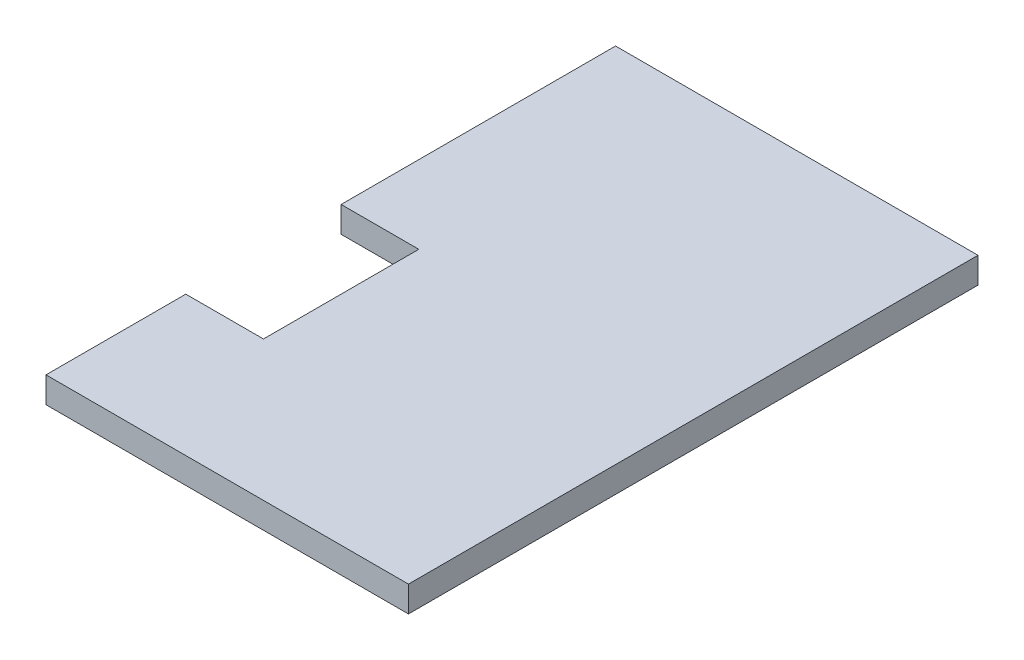
ISO-10303-21;
HEADER;
FILE_DESCRIPTION(('STEP AP214'),'2;1');
FILE_NAME('part.step','',(''),(''),'','','');
FILE_SCHEMA(('AUTOMOTIVE_DESIGN { 1 0 10303 214 1 1 1 1 }'));
ENDSEC;
DATA;
#1=APPLICATION_CONTEXT('core data for automotive mechanical design processes');
#2=APPLICATION_PROTOCOL_DEFINITION('international standard','automotive_design',2000,#1);
#3=PRODUCT_CONTEXT('',#1,'mechanical');
#4=PRODUCT('Part','Part','',(#3));
#5=PRODUCT_RELATED_PRODUCT_CATEGORY('part','',(#4));
#6=PRODUCT_DEFINITION_FORMATION('','',#4);
#7=PRODUCT_DEFINITION_CONTEXT('part definition',#1,'design');
#8=PRODUCT_DEFINITION('design','',#6,#7);
#9=PRODUCT_DEFINITION_SHAPE('','',#8);
#10=(LENGTH_UNIT() NAMED_UNIT(*) SI_UNIT(.MILLI.,.METRE.));
#11=(NAMED_UNIT(*) PLANE_ANGLE_UNIT() SI_UNIT($,.RADIAN.));
#12=(NAMED_UNIT(*) SI_UNIT($,.STERADIAN.) SOLID_ANGLE_UNIT());
#13=UNCERTAINTY_MEASURE_WITH_UNIT(LENGTH_MEASURE(1.E-05),#10,'distance_accuracy_value','');
#14=(GEOMETRIC_REPRESENTATION_CONTEXT(3) GLOBAL_UNCERTAINTY_ASSIGNED_CONTEXT((#13)) GLOBAL_UNIT_ASSIGNED_CONTEXT((#10,
#11,#12)) REPRESENTATION_CONTEXT('',''));
#15=CARTESIAN_POINT('',(0.,0.,0.));
#16=DIRECTION('',(0.,0.,1.));
#17=DIRECTION('',(1.,0.,0.));
#18=AXIS2_PLACEMENT_3D('',#15,#16,#17);
#19=CARTESIAN_POINT('',(-15.9205776173285,5.,-27.9241877256318));
#20=DIRECTION('',(1.,0.,0.));
#21=DIRECTION('',(0.,0.,-1.));
#22=AXIS2_PLACEMENT_3D('',#19,#20,#21);
#23=PLANE('',#22);
#24=DIRECTION('',(0.,0.,1.));
#25=VECTOR('',#24,1.);
#26=CARTESIAN_POINT('',(-15.9205776173285,0.,-27.9241877256318));
#27=LINE('',#26,#25);
#28=CARTESIAN_POINT('',(-15.9205776173285,0.,-27.9241877256318));
#29=VERTEX_POINT('',#28);
#30=CARTESIAN_POINT('',(-15.9205776173285,0.,25.0758122743682));
#31=VERTEX_POINT('',#30);
#32=EDGE_CURVE('E125',#29,#31,#27,.T.);
#33=ORIENTED_EDGE('',*,*,#32,.T.);
#34=DIRECTION('',(0.,1.,0.));
#35=VECTOR('',#34,1.);
#36=CARTESIAN_POINT('',(-15.9205776173285,0.,25.0758122743682));
#37=LINE('',#36,#35);
#38=CARTESIAN_POINT('',(-15.9205776173285,5.,25.0758122743682));
#39=VERTEX_POINT('',#38);
#40=EDGE_CURVE('E126',#31,#39,#37,.T.);
#41=ORIENTED_EDGE('',*,*,#40,.T.);
#42=DIRECTION('',(0.,0.,1.));
#43=VECTOR('',#42,1.);
#44=CARTESIAN_POINT('',(-15.9205776173285,5.,-27.9241877256318));
#45=LINE('',#44,#43);
#46=CARTESIAN_POINT('',(-15.9205776173285,5.,-27.9241877256318));
#47=VERTEX_POINT('',#46);
#48=EDGE_CURVE('E155',#47,#39,#45,.T.);
#49=ORIENTED_EDGE('',*,*,#48,.F.);
#50=DIRECTION('',(0.,-1.,0.));
#51=VECTOR('',#50,1.);
#52=CARTESIAN_POINT('',(-15.9205776173285,5.,-27.9241877256318));
#53=LINE('',#52,#51);
#54=EDGE_CURVE('E139',#47,#29,#53,.T.);
#55=ORIENTED_EDGE('',*,*,#54,.T.);
#56=EDGE_LOOP('',(#33,#41,#49,#55));
#57=FACE_BOUND('',#56,.T.);
#58=ADVANCED_FACE('F32',(#57),#23,.F.);
#59=CARTESIAN_POINT('',(-15.9205776173285,5.,55.0758122743682));
#60=VERTEX_POINT('',#59);
#61=CARTESIAN_POINT('',(-15.9205776173285,5.,82.0758122743682));
#62=VERTEX_POINT('',#61);
#63=EDGE_CURVE('E84',#60,#62,#45,.T.);
#64=ORIENTED_EDGE('',*,*,#63,.F.);
#65=DIRECTION('',(0.,1.,0.));
#66=VECTOR('',#65,1.);
#67=CARTESIAN_POINT('',(-15.9205776173285,0.,55.0758122743682));
#68=LINE('',#67,#66);
#69=CARTESIAN_POINT('',(-15.9205776173285,0.,55.0758122743682));
#70=VERTEX_POINT('',#69);
#71=EDGE_CURVE('E110',#70,#60,#68,.T.);
#72=ORIENTED_EDGE('',*,*,#71,.F.);
#73=CARTESIAN_POINT('',(-15.9205776173285,0.,82.0758122743682));
#74=VERTEX_POINT('',#73);
#75=EDGE_CURVE('E118',#70,#74,#27,.T.);
#76=ORIENTED_EDGE('',*,*,#75,.T.);
#77=DIRECTION('',(0.,-1.,0.));
#78=VECTOR('',#77,1.);
#79=CARTESIAN_POINT('',(-15.9205776173285,5.,82.0758122743682));
#80=LINE('',#79,#78);
#81=EDGE_CURVE('E11',#62,#74,#80,.T.);
#82=ORIENTED_EDGE('',*,*,#81,.F.);
#83=EDGE_LOOP('',(#64,#72,#76,#82));
#84=FACE_BOUND('',#83,.T.);
#85=ADVANCED_FACE('F34',(#84),#23,.F.);
#86=CARTESIAN_POINT('',(-15.9205776173285,5.,82.0758122743682));
#87=DIRECTION('',(0.,0.,-1.));
#88=DIRECTION('',(-1.,0.,0.));
#89=AXIS2_PLACEMENT_3D('',#86,#87,#88);
#90=PLANE('',#89);
#91=DIRECTION('',(1.,0.,0.));
#92=VECTOR('',#91,1.);
#93=CARTESIAN_POINT('',(-15.9205776173285,0.,82.0758122743682));
#94=LINE('',#93,#92);
#95=CARTESIAN_POINT('',(54.0794223826715,0.,82.0758122743682));
#96=VERTEX_POINT('',#95);
#97=EDGE_CURVE('E124',#74,#96,#94,.T.);
#98=ORIENTED_EDGE('',*,*,#97,.T.);
#99=DIRECTION('',(0.,-1.,0.));
#100=VECTOR('',#99,1.);
#101=CARTESIAN_POINT('',(54.0794223826715,5.,82.0758122743682));
#102=LINE('',#101,#100);
#103=CARTESIAN_POINT('',(54.0794223826715,5.,82.0758122743682));
#104=VERTEX_POINT('',#103);
#105=EDGE_CURVE('E40',#104,#96,#102,.T.);
#106=ORIENTED_EDGE('',*,*,#105,.F.);
#107=DIRECTION('',(1.,0.,0.));
#108=VECTOR('',#107,1.);
#109=CARTESIAN_POINT('',(-15.9205776173285,5.,82.0758122743682));
#110=LINE('',#109,#108);
#111=EDGE_CURVE('E157',#62,#104,#110,.T.);
#112=ORIENTED_EDGE('',*,*,#111,.F.);
#113=ORIENTED_EDGE('',*,*,#81,.T.);
#114=EDGE_LOOP('',(#98,#106,#112,#113));
#115=FACE_BOUND('',#114,.T.);
#116=ADVANCED_FACE('F188',(#115),#90,.F.);
#117=CARTESIAN_POINT('',(54.0794223826715,5.,-27.9241877256318));
#118=DIRECTION('',(-1.,0.,0.));
#119=DIRECTION('',(0.,0.,1.));
#120=AXIS2_PLACEMENT_3D('',#117,#118,#119);
#121=PLANE('',#120);
#122=DIRECTION('',(0.,0.,-1.));
#123=VECTOR('',#122,1.);
#124=CARTESIAN_POINT('',(54.0794223826715,0.,-27.9241877256318));
#125=LINE('',#124,#123);
#126=CARTESIAN_POINT('',(54.0794223826715,0.,-27.9241877256318));
#127=VERTEX_POINT('',#126);
#128=EDGE_CURVE('E136',#96,#127,#125,.T.);
#129=ORIENTED_EDGE('',*,*,#128,.T.);
#130=DIRECTION('',(0.,-1.,0.));
#131=VECTOR('',#130,1.);
#132=CARTESIAN_POINT('',(54.0794223826715,5.,-27.9241877256318));
#133=LINE('',#132,#131);
#134=CARTESIAN_POINT('',(54.0794223826715,5.,-27.9241877256318));
#135=VERTEX_POINT('',#134);
#136=EDGE_CURVE('E141',#135,#127,#133,.T.);
#137=ORIENTED_EDGE('',*,*,#136,.F.);
#138=DIRECTION('',(0.,0.,-1.));
#139=VECTOR('',#138,1.);
#140=CARTESIAN_POINT('',(54.0794223826715,5.,-27.9241877256318));
#141=LINE('',#140,#139);
#142=EDGE_CURVE('E148',#104,#135,#141,.T.);
#143=ORIENTED_EDGE('',*,*,#142,.F.);
#144=ORIENTED_EDGE('',*,*,#105,.T.);
#145=EDGE_LOOP('',(#129,#137,#143,#144));
#146=FACE_BOUND('',#145,.T.);
#147=ADVANCED_FACE('F146',(#146),#121,.F.);
#148=CARTESIAN_POINT('',(-15.9205776173285,5.,-27.9241877256318));
#149=DIRECTION('',(0.,0.,1.));
#150=DIRECTION('',(1.,0.,0.));
#151=AXIS2_PLACEMENT_3D('',#148,#149,#150);
#152=PLANE('',#151);
#153=DIRECTION('',(-1.,0.,0.));
#154=VECTOR('',#153,1.);
#155=CARTESIAN_POINT('',(-15.9205776173285,0.,-27.9241877256318));
#156=LINE('',#155,#154);
#157=EDGE_CURVE('E77',#127,#29,#156,.T.);
#158=ORIENTED_EDGE('',*,*,#157,.T.);
#159=ORIENTED_EDGE('',*,*,#54,.F.);
#160=DIRECTION('',(-1.,0.,0.));
#161=VECTOR('',#160,1.);
#162=CARTESIAN_POINT('',(-15.9205776173285,5.,-27.9241877256318));
#163=LINE('',#162,#161);
#164=EDGE_CURVE('E56',#135,#47,#163,.T.);
#165=ORIENTED_EDGE('',*,*,#164,.F.);
#166=ORIENTED_EDGE('',*,*,#136,.T.);
#167=EDGE_LOOP('',(#158,#159,#165,#166));
#168=FACE_BOUND('',#167,.T.);
#169=ADVANCED_FACE('F156',(#168),#152,.F.);
#170=CARTESIAN_POINT('',(0.,5.,0.));
#171=DIRECTION('',(0.,1.,0.));
#172=DIRECTION('',(0.,0.,1.));
#173=AXIS2_PLACEMENT_3D('',#170,#171,#172);
#174=PLANE('',#173);
#175=DIRECTION('',(-1.,0.,0.));
#176=VECTOR('',#175,1.);
#177=CARTESIAN_POINT('',(-15.9205776173285,5.,25.0758122743682));
#178=LINE('',#177,#176);
#179=CARTESIAN_POINT('',(-0.920577617328525,5.,25.0758122743682));
#180=VERTEX_POINT('',#179);
#181=EDGE_CURVE('E114',#180,#39,#178,.T.);
#182=ORIENTED_EDGE('',*,*,#181,.F.);
#183=DIRECTION('',(0.,0.,-1.));
#184=VECTOR('',#183,1.);
#185=CARTESIAN_POINT('',(-0.920577617328525,5.,25.0758122743682));
#186=LINE('',#185,#184);
#187=CARTESIAN_POINT('',(-0.920577617328521,5.,55.0758122743682));
#188=VERTEX_POINT('',#187);
#189=EDGE_CURVE('E164',#188,#180,#186,.T.);
#190=ORIENTED_EDGE('',*,*,#189,.F.);
#191=DIRECTION('',(1.,0.,0.));
#192=VECTOR('',#191,1.);
#193=CARTESIAN_POINT('',(-0.920577617328521,5.,55.0758122743682));
#194=LINE('',#193,#192);
#195=EDGE_CURVE('E167',#60,#188,#194,.T.);
#196=ORIENTED_EDGE('',*,*,#195,.F.);
#197=ORIENTED_EDGE('',*,*,#63,.T.);
#198=ORIENTED_EDGE('',*,*,#111,.T.);
#199=ORIENTED_EDGE('',*,*,#142,.T.);
#200=ORIENTED_EDGE('',*,*,#164,.T.);
#201=ORIENTED_EDGE('',*,*,#48,.T.);
#202=EDGE_LOOP('',(#182,#190,#196,#197,#198,#199,#200,#201));
#203=FACE_BOUND('',#202,.T.);
#204=ADVANCED_FACE('F172',(#203),#174,.T.);
#205=CARTESIAN_POINT('',(0.,0.,0.));
#206=DIRECTION('',(0.,1.,0.));
#207=DIRECTION('',(0.,0.,1.));
#208=AXIS2_PLACEMENT_3D('',#205,#206,#207);
#209=PLANE('',#208);
#210=DIRECTION('',(0.,0.,-1.));
#211=VECTOR('',#210,1.);
#212=CARTESIAN_POINT('',(-0.920577617328525,0.,25.0758122743682));
#213=LINE('',#212,#211);
#214=CARTESIAN_POINT('',(-0.920577617328521,0.,55.0758122743682));
#215=VERTEX_POINT('',#214);
#216=CARTESIAN_POINT('',(-0.920577617328525,0.,25.0758122743682));
#217=VERTEX_POINT('',#216);
#218=EDGE_CURVE('E47',#215,#217,#213,.T.);
#219=ORIENTED_EDGE('',*,*,#218,.T.);
#220=DIRECTION('',(-1.,0.,0.));
#221=VECTOR('',#220,1.);
#222=CARTESIAN_POINT('',(-15.9205776173285,0.,25.0758122743682));
#223=LINE('',#222,#221);
#224=EDGE_CURVE('E120',#217,#31,#223,.T.);
#225=ORIENTED_EDGE('',*,*,#224,.T.);
#226=ORIENTED_EDGE('',*,*,#32,.F.);
#227=ORIENTED_EDGE('',*,*,#157,.F.);
#228=ORIENTED_EDGE('',*,*,#128,.F.);
#229=ORIENTED_EDGE('',*,*,#97,.F.);
#230=ORIENTED_EDGE('',*,*,#75,.F.);
#231=DIRECTION('',(1.,0.,0.));
#232=VECTOR('',#231,1.);
#233=CARTESIAN_POINT('',(-0.920577617328521,0.,55.0758122743682));
#234=LINE('',#233,#232);
#235=EDGE_CURVE('E106',#70,#215,#234,.T.);
#236=ORIENTED_EDGE('',*,*,#235,.T.);
#237=EDGE_LOOP('',(#219,#225,#226,#227,#228,#229,#230,#236));
#238=FACE_BOUND('',#237,.T.);
#239=ADVANCED_FACE('F122',(#238),#209,.F.);
#240=CARTESIAN_POINT('',(-15.9205776173285,0.,25.0758122743682));
#241=DIRECTION('',(0.,0.,-1.));
#242=DIRECTION('',(-1.,0.,0.));
#243=AXIS2_PLACEMENT_3D('',#240,#241,#242);
#244=PLANE('',#243);
#245=ORIENTED_EDGE('',*,*,#181,.T.);
#246=ORIENTED_EDGE('',*,*,#40,.F.);
#247=ORIENTED_EDGE('',*,*,#224,.F.);
#248=DIRECTION('',(0.,1.,0.));
#249=VECTOR('',#248,1.);
#250=CARTESIAN_POINT('',(-0.920577617328525,0.,25.0758122743682));
#251=LINE('',#250,#249);
#252=EDGE_CURVE('E130',#217,#180,#251,.T.);
#253=ORIENTED_EDGE('',*,*,#252,.T.);
#254=EDGE_LOOP('',(#245,#246,#247,#253));
#255=FACE_BOUND('',#254,.T.);
#256=ADVANCED_FACE('F175',(#255),#244,.F.);
#257=CARTESIAN_POINT('',(-0.920577617328525,0.,25.0758122743682));
#258=DIRECTION('',(1.,0.,0.));
#259=DIRECTION('',(0.,0.,-1.));
#260=AXIS2_PLACEMENT_3D('',#257,#258,#259);
#261=PLANE('',#260);
#262=ORIENTED_EDGE('',*,*,#189,.T.);
#263=ORIENTED_EDGE('',*,*,#252,.F.);
#264=ORIENTED_EDGE('',*,*,#218,.F.);
#265=DIRECTION('',(0.,1.,0.));
#266=VECTOR('',#265,1.);
#267=CARTESIAN_POINT('',(-0.920577617328521,0.,55.0758122743682));
#268=LINE('',#267,#266);
#269=EDGE_CURVE('E111',#215,#188,#268,.T.);
#270=ORIENTED_EDGE('',*,*,#269,.T.);
#271=EDGE_LOOP('',(#262,#263,#264,#270));
#272=FACE_BOUND('',#271,.T.);
#273=ADVANCED_FACE('F173',(#272),#261,.F.);
#274=CARTESIAN_POINT('',(-0.920577617328521,0.,55.0758122743682));
#275=DIRECTION('',(0.,0.,1.));
#276=DIRECTION('',(1.,0.,0.));
#277=AXIS2_PLACEMENT_3D('',#274,#275,#276);
#278=PLANE('',#277);
#279=ORIENTED_EDGE('',*,*,#195,.T.);
#280=ORIENTED_EDGE('',*,*,#269,.F.);
#281=ORIENTED_EDGE('',*,*,#235,.F.);
#282=ORIENTED_EDGE('',*,*,#71,.T.);
#283=EDGE_LOOP('',(#279,#280,#281,#282));
#284=FACE_BOUND('',#283,.T.);
#285=ADVANCED_FACE('F109',(#284),#278,.F.);
#286=CLOSED_SHELL('',(#58,#85,#116,#147,#169,#204,#239,#256,#273,#285));
#287=MANIFOLD_SOLID_BREP('B2',#286);
#288=ADVANCED_BREP_SHAPE_REPRESENTATION('',(#18,#287),#14);
#289=SHAPE_DEFINITION_REPRESENTATION(#9,#288);
ENDSEC;
END-ISO-10303-21;
